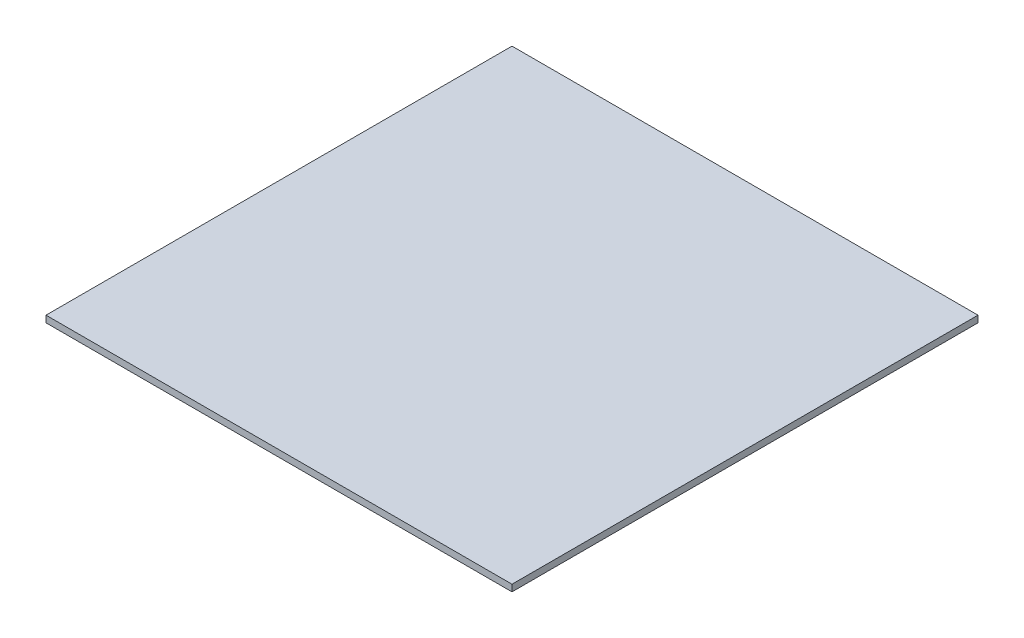
ISO-10303-21;
HEADER;
FILE_DESCRIPTION(('STEP AP214'),'2;1');
FILE_NAME('part.step','',(''),(''),'','','');
FILE_SCHEMA(('AUTOMOTIVE_DESIGN { 1 0 10303 214 1 1 1 1 }'));
ENDSEC;
DATA;
#1=APPLICATION_CONTEXT('core data for automotive mechanical design processes');
#2=APPLICATION_PROTOCOL_DEFINITION('international standard','automotive_design',2000,#1);
#3=PRODUCT_CONTEXT('',#1,'mechanical');
#4=PRODUCT('Part','Part','',(#3));
#5=PRODUCT_RELATED_PRODUCT_CATEGORY('part','',(#4));
#6=PRODUCT_DEFINITION_FORMATION('','',#4);
#7=PRODUCT_DEFINITION_CONTEXT('part definition',#1,'design');
#8=PRODUCT_DEFINITION('design','',#6,#7);
#9=PRODUCT_DEFINITION_SHAPE('','',#8);
#10=(LENGTH_UNIT() NAMED_UNIT(*) SI_UNIT(.MILLI.,.METRE.));
#11=(NAMED_UNIT(*) PLANE_ANGLE_UNIT() SI_UNIT($,.RADIAN.));
#12=(NAMED_UNIT(*) SI_UNIT($,.STERADIAN.) SOLID_ANGLE_UNIT());
#13=UNCERTAINTY_MEASURE_WITH_UNIT(LENGTH_MEASURE(1.E-05),#10,'distance_accuracy_value','');
#14=(GEOMETRIC_REPRESENTATION_CONTEXT(3) GLOBAL_UNCERTAINTY_ASSIGNED_CONTEXT((#13)) GLOBAL_UNIT_ASSIGNED_CONTEXT((#10,
#11,#12)) REPRESENTATION_CONTEXT('',''));
#15=CARTESIAN_POINT('',(0.,0.,0.));
#16=DIRECTION('',(0.,0.,1.));
#17=DIRECTION('',(1.,0.,0.));
#18=AXIS2_PLACEMENT_3D('',#15,#16,#17);
#19=CARTESIAN_POINT('',(-1750.,50.,1750.));
#20=DIRECTION('',(1.,0.,0.));
#21=DIRECTION('',(0.,0.,-1.));
#22=AXIS2_PLACEMENT_3D('',#19,#20,#21);
#23=PLANE('',#22);
#24=DIRECTION('',(0.,0.,1.));
#25=VECTOR('',#24,1.);
#26=CARTESIAN_POINT('',(-1750.,0.,1750.));
#27=LINE('',#26,#25);
#28=CARTESIAN_POINT('',(-1750.,0.,-1750.));
#29=VERTEX_POINT('',#28);
#30=CARTESIAN_POINT('',(-1750.,0.,1750.));
#31=VERTEX_POINT('',#30);
#32=EDGE_CURVE('E141',#29,#31,#27,.T.);
#33=ORIENTED_EDGE('',*,*,#32,.T.);
#34=DIRECTION('',(0.,-1.,0.));
#35=VECTOR('',#34,1.);
#36=CARTESIAN_POINT('',(-1750.,50.,1750.));
#37=LINE('',#36,#35);
#38=CARTESIAN_POINT('',(-1750.,50.,1750.));
#39=VERTEX_POINT('',#38);
#40=EDGE_CURVE('E11',#39,#31,#37,.T.);
#41=ORIENTED_EDGE('',*,*,#40,.F.);
#42=DIRECTION('',(0.,0.,1.));
#43=VECTOR('',#42,1.);
#44=CARTESIAN_POINT('',(-1750.,50.,1750.));
#45=LINE('',#44,#43);
#46=CARTESIAN_POINT('',(-1750.,50.,-1750.));
#47=VERTEX_POINT('',#46);
#48=EDGE_CURVE('E145',#47,#39,#45,.T.);
#49=ORIENTED_EDGE('',*,*,#48,.F.);
#50=DIRECTION('',(0.,-1.,0.));
#51=VECTOR('',#50,1.);
#52=CARTESIAN_POINT('',(-1750.,50.,-1750.));
#53=LINE('',#52,#51);
#54=EDGE_CURVE('E151',#47,#29,#53,.T.);
#55=ORIENTED_EDGE('',*,*,#54,.T.);
#56=EDGE_LOOP('',(#33,#41,#49,#55));
#57=FACE_BOUND('',#56,.T.);
#58=ADVANCED_FACE('F33',(#57),#23,.F.);
#59=CARTESIAN_POINT('',(1750.,50.,1750.));
#60=DIRECTION('',(0.,0.,-1.));
#61=DIRECTION('',(-1.,0.,0.));
#62=AXIS2_PLACEMENT_3D('',#59,#60,#61);
#63=PLANE('',#62);
#64=DIRECTION('',(1.,0.,0.));
#65=VECTOR('',#64,1.);
#66=CARTESIAN_POINT('',(1750.,0.,1750.));
#67=LINE('',#66,#65);
#68=CARTESIAN_POINT('',(1750.,0.,1750.));
#69=VERTEX_POINT('',#68);
#70=EDGE_CURVE('E154',#31,#69,#67,.T.);
#71=ORIENTED_EDGE('',*,*,#70,.T.);
#72=DIRECTION('',(0.,-1.,0.));
#73=VECTOR('',#72,1.);
#74=CARTESIAN_POINT('',(1750.,50.,1750.));
#75=LINE('',#74,#73);
#76=CARTESIAN_POINT('',(1750.,50.,1750.));
#77=VERTEX_POINT('',#76);
#78=EDGE_CURVE('E40',#77,#69,#75,.T.);
#79=ORIENTED_EDGE('',*,*,#78,.F.);
#80=DIRECTION('',(1.,0.,0.));
#81=VECTOR('',#80,1.);
#82=CARTESIAN_POINT('',(1750.,50.,1750.));
#83=LINE('',#82,#81);
#84=EDGE_CURVE('E84',#39,#77,#83,.T.);
#85=ORIENTED_EDGE('',*,*,#84,.F.);
#86=ORIENTED_EDGE('',*,*,#40,.T.);
#87=EDGE_LOOP('',(#71,#79,#85,#86));
#88=FACE_BOUND('',#87,.T.);
#89=ADVANCED_FACE('F182',(#88),#63,.F.);
#90=CARTESIAN_POINT('',(1750.,50.,1750.));
#91=DIRECTION('',(-1.,0.,0.));
#92=DIRECTION('',(0.,0.,1.));
#93=AXIS2_PLACEMENT_3D('',#90,#91,#92);
#94=PLANE('',#93);
#95=DIRECTION('',(0.,0.,-1.));
#96=VECTOR('',#95,1.);
#97=CARTESIAN_POINT('',(1750.,0.,1750.));
#98=LINE('',#97,#96);
#99=CARTESIAN_POINT('',(1750.,0.,-1750.));
#100=VERTEX_POINT('',#99);
#101=EDGE_CURVE('E156',#69,#100,#98,.T.);
#102=ORIENTED_EDGE('',*,*,#101,.T.);
#103=DIRECTION('',(0.,-1.,0.));
#104=VECTOR('',#103,1.);
#105=CARTESIAN_POINT('',(1750.,50.,-1750.));
#106=LINE('',#105,#104);
#107=CARTESIAN_POINT('',(1750.,50.,-1750.));
#108=VERTEX_POINT('',#107);
#109=EDGE_CURVE('E160',#108,#100,#106,.T.);
#110=ORIENTED_EDGE('',*,*,#109,.F.);
#111=DIRECTION('',(0.,0.,-1.));
#112=VECTOR('',#111,1.);
#113=CARTESIAN_POINT('',(1750.,50.,1750.));
#114=LINE('',#113,#112);
#115=EDGE_CURVE('E148',#77,#108,#114,.T.);
#116=ORIENTED_EDGE('',*,*,#115,.F.);
#117=ORIENTED_EDGE('',*,*,#78,.T.);
#118=EDGE_LOOP('',(#102,#110,#116,#117));
#119=FACE_BOUND('',#118,.T.);
#120=ADVANCED_FACE('F165',(#119),#94,.F.);
#121=CARTESIAN_POINT('',(1750.,50.,-1750.));
#122=DIRECTION('',(0.,0.,1.));
#123=DIRECTION('',(1.,0.,0.));
#124=AXIS2_PLACEMENT_3D('',#121,#122,#123);
#125=PLANE('',#124);
#126=DIRECTION('',(-1.,0.,0.));
#127=VECTOR('',#126,1.);
#128=CARTESIAN_POINT('',(1750.,0.,-1750.));
#129=LINE('',#128,#127);
#130=EDGE_CURVE('E77',#100,#29,#129,.T.);
#131=ORIENTED_EDGE('',*,*,#130,.T.);
#132=ORIENTED_EDGE('',*,*,#54,.F.);
#133=DIRECTION('',(-1.,0.,0.));
#134=VECTOR('',#133,1.);
#135=CARTESIAN_POINT('',(1750.,50.,-1750.));
#136=LINE('',#135,#134);
#137=EDGE_CURVE('E56',#108,#47,#136,.T.);
#138=ORIENTED_EDGE('',*,*,#137,.F.);
#139=ORIENTED_EDGE('',*,*,#109,.T.);
#140=EDGE_LOOP('',(#131,#132,#138,#139));
#141=FACE_BOUND('',#140,.T.);
#142=ADVANCED_FACE('F173',(#141),#125,.F.);
#143=CARTESIAN_POINT('',(0.,50.,0.));
#144=DIRECTION('',(0.,1.,0.));
#145=DIRECTION('',(0.,0.,1.));
#146=AXIS2_PLACEMENT_3D('',#143,#144,#145);
#147=PLANE('',#146);
#148=ORIENTED_EDGE('',*,*,#48,.T.);
#149=ORIENTED_EDGE('',*,*,#84,.T.);
#150=ORIENTED_EDGE('',*,*,#115,.T.);
#151=ORIENTED_EDGE('',*,*,#137,.T.);
#152=EDGE_LOOP('',(#148,#149,#150,#151));
#153=FACE_BOUND('',#152,.T.);
#154=ADVANCED_FACE('F175',(#153),#147,.T.);
#155=CARTESIAN_POINT('',(0.,0.,0.));
#156=DIRECTION('',(0.,1.,0.));
#157=DIRECTION('',(0.,0.,1.));
#158=AXIS2_PLACEMENT_3D('',#155,#156,#157);
#159=PLANE('',#158);
#160=DIRECTION('',(1.,0.,0.));
#161=VECTOR('',#160,1.);
#162=CARTESIAN_POINT('',(375.,0.,-375.));
#163=LINE('',#162,#161);
#164=CARTESIAN_POINT('',(-375.,0.,-375.));
#165=VERTEX_POINT('',#164);
#166=CARTESIAN_POINT('',(375.,0.,-375.));
#167=VERTEX_POINT('',#166);
#168=EDGE_CURVE('E135',#165,#167,#163,.T.);
#169=ORIENTED_EDGE('',*,*,#168,.F.);
#170=DIRECTION('',(0.,0.,-1.));
#171=VECTOR('',#170,1.);
#172=CARTESIAN_POINT('',(-375.,0.,-375.));
#173=LINE('',#172,#171);
#174=CARTESIAN_POINT('',(-375.,0.,375.));
#175=VERTEX_POINT('',#174);
#176=EDGE_CURVE('E47',#175,#165,#173,.T.);
#177=ORIENTED_EDGE('',*,*,#176,.F.);
#178=DIRECTION('',(-1.,0.,0.));
#179=VECTOR('',#178,1.);
#180=CARTESIAN_POINT('',(375.,0.,375.));
#181=LINE('',#180,#179);
#182=CARTESIAN_POINT('',(375.,0.,375.));
#183=VERTEX_POINT('',#182);
#184=EDGE_CURVE('E126',#183,#175,#181,.T.);
#185=ORIENTED_EDGE('',*,*,#184,.F.);
#186=DIRECTION('',(0.,0.,1.));
#187=VECTOR('',#186,1.);
#188=CARTESIAN_POINT('',(375.,0.,-375.));
#189=LINE('',#188,#187);
#190=EDGE_CURVE('E129',#167,#183,#189,.T.);
#191=ORIENTED_EDGE('',*,*,#190,.F.);
#192=EDGE_LOOP('',(#169,#177,#185,#191));
#193=FACE_BOUND('',#192,.T.);
#194=ORIENTED_EDGE('',*,*,#32,.F.);
#195=ORIENTED_EDGE('',*,*,#130,.F.);
#196=ORIENTED_EDGE('',*,*,#101,.F.);
#197=ORIENTED_EDGE('',*,*,#70,.F.);
#198=EDGE_LOOP('',(#194,#195,#196,#197));
#199=FACE_BOUND('',#198,.T.);
#200=ADVANCED_FACE('F169',(#193,#199),#159,.F.);
#201=CARTESIAN_POINT('',(-375.,10.,-375.));
#202=DIRECTION('',(-1.,0.,0.));
#203=DIRECTION('',(0.,0.,1.));
#204=AXIS2_PLACEMENT_3D('',#201,#202,#203);
#205=PLANE('',#204);
#206=ORIENTED_EDGE('',*,*,#176,.T.);
#207=DIRECTION('',(0.,-1.,0.));
#208=VECTOR('',#207,1.);
#209=CARTESIAN_POINT('',(-375.,10.,-375.));
#210=LINE('',#209,#208);
#211=CARTESIAN_POINT('',(-375.,10.,-375.));
#212=VERTEX_POINT('',#211);
#213=EDGE_CURVE('E104',#212,#165,#210,.T.);
#214=ORIENTED_EDGE('',*,*,#213,.F.);
#215=DIRECTION('',(0.,0.,-1.));
#216=VECTOR('',#215,1.);
#217=CARTESIAN_POINT('',(-375.,10.,-375.));
#218=LINE('',#217,#216);
#219=CARTESIAN_POINT('',(-375.,10.,375.));
#220=VERTEX_POINT('',#219);
#221=EDGE_CURVE('E108',#220,#212,#218,.T.);
#222=ORIENTED_EDGE('',*,*,#221,.F.);
#223=DIRECTION('',(0.,-1.,0.));
#224=VECTOR('',#223,1.);
#225=CARTESIAN_POINT('',(-375.,10.,375.));
#226=LINE('',#225,#224);
#227=EDGE_CURVE('E139',#220,#175,#226,.T.);
#228=ORIENTED_EDGE('',*,*,#227,.T.);
#229=EDGE_LOOP('',(#206,#214,#222,#228));
#230=FACE_BOUND('',#229,.T.);
#231=ADVANCED_FACE('F106',(#230),#205,.F.);
#232=CARTESIAN_POINT('',(375.,10.,375.));
#233=DIRECTION('',(0.,0.,1.));
#234=DIRECTION('',(1.,0.,0.));
#235=AXIS2_PLACEMENT_3D('',#232,#233,#234);
#236=PLANE('',#235);
#237=ORIENTED_EDGE('',*,*,#184,.T.);
#238=ORIENTED_EDGE('',*,*,#227,.F.);
#239=DIRECTION('',(-1.,0.,0.));
#240=VECTOR('',#239,1.);
#241=CARTESIAN_POINT('',(375.,10.,375.));
#242=LINE('',#241,#240);
#243=CARTESIAN_POINT('',(375.,10.,375.));
#244=VERTEX_POINT('',#243);
#245=EDGE_CURVE('E114',#244,#220,#242,.T.);
#246=ORIENTED_EDGE('',*,*,#245,.F.);
#247=DIRECTION('',(0.,-1.,0.));
#248=VECTOR('',#247,1.);
#249=CARTESIAN_POINT('',(375.,10.,375.));
#250=LINE('',#249,#248);
#251=EDGE_CURVE('E142',#244,#183,#250,.T.);
#252=ORIENTED_EDGE('',*,*,#251,.T.);
#253=EDGE_LOOP('',(#237,#238,#246,#252));
#254=FACE_BOUND('',#253,.T.);
#255=ADVANCED_FACE('F222',(#254),#236,.F.);
#256=CARTESIAN_POINT('',(375.,10.,-375.));
#257=DIRECTION('',(1.,0.,0.));
#258=DIRECTION('',(0.,0.,-1.));
#259=AXIS2_PLACEMENT_3D('',#256,#257,#258);
#260=PLANE('',#259);
#261=ORIENTED_EDGE('',*,*,#190,.T.);
#262=ORIENTED_EDGE('',*,*,#251,.F.);
#263=DIRECTION('',(0.,0.,1.));
#264=VECTOR('',#263,1.);
#265=CARTESIAN_POINT('',(375.,10.,-375.));
#266=LINE('',#265,#264);
#267=CARTESIAN_POINT('',(375.,10.,-375.));
#268=VERTEX_POINT('',#267);
#269=EDGE_CURVE('E122',#268,#244,#266,.T.);
#270=ORIENTED_EDGE('',*,*,#269,.F.);
#271=DIRECTION('',(0.,-1.,0.));
#272=VECTOR('',#271,1.);
#273=CARTESIAN_POINT('',(375.,10.,-375.));
#274=LINE('',#273,#272);
#275=EDGE_CURVE('E113',#268,#167,#274,.T.);
#276=ORIENTED_EDGE('',*,*,#275,.T.);
#277=EDGE_LOOP('',(#261,#262,#270,#276));
#278=FACE_BOUND('',#277,.T.);
#279=ADVANCED_FACE('F231',(#278),#260,.F.);
#280=CARTESIAN_POINT('',(375.,10.,-375.));
#281=DIRECTION('',(0.,0.,-1.));
#282=DIRECTION('',(-1.,0.,0.));
#283=AXIS2_PLACEMENT_3D('',#280,#281,#282);
#284=PLANE('',#283);
#285=ORIENTED_EDGE('',*,*,#168,.T.);
#286=ORIENTED_EDGE('',*,*,#275,.F.);
#287=DIRECTION('',(1.,0.,0.));
#288=VECTOR('',#287,1.);
#289=CARTESIAN_POINT('',(375.,10.,-375.));
#290=LINE('',#289,#288);
#291=EDGE_CURVE('E117',#212,#268,#290,.T.);
#292=ORIENTED_EDGE('',*,*,#291,.F.);
#293=ORIENTED_EDGE('',*,*,#213,.T.);
#294=EDGE_LOOP('',(#285,#286,#292,#293));
#295=FACE_BOUND('',#294,.T.);
#296=ADVANCED_FACE('F118',(#295),#284,.F.);
#297=CARTESIAN_POINT('',(0.,10.,0.));
#298=DIRECTION('',(0.,-1.,0.));
#299=DIRECTION('',(0.,0.,-1.));
#300=AXIS2_PLACEMENT_3D('',#297,#298,#299);
#301=PLANE('',#300);
#302=ORIENTED_EDGE('',*,*,#221,.T.);
#303=ORIENTED_EDGE('',*,*,#291,.T.);
#304=ORIENTED_EDGE('',*,*,#269,.T.);
#305=ORIENTED_EDGE('',*,*,#245,.T.);
#306=EDGE_LOOP('',(#302,#303,#304,#305));
#307=FACE_BOUND('',#306,.T.);
#308=ADVANCED_FACE('F124',(#307),#301,.T.);
#309=CLOSED_SHELL('',(#58,#89,#120,#142,#154,#200,#231,#255,#279,#296,#308));
#310=MANIFOLD_SOLID_BREP('B2',#309);
#311=ADVANCED_BREP_SHAPE_REPRESENTATION('',(#18,#310),#14);
#312=SHAPE_DEFINITION_REPRESENTATION(#9,#311);
ENDSEC;
END-ISO-10303-21;
